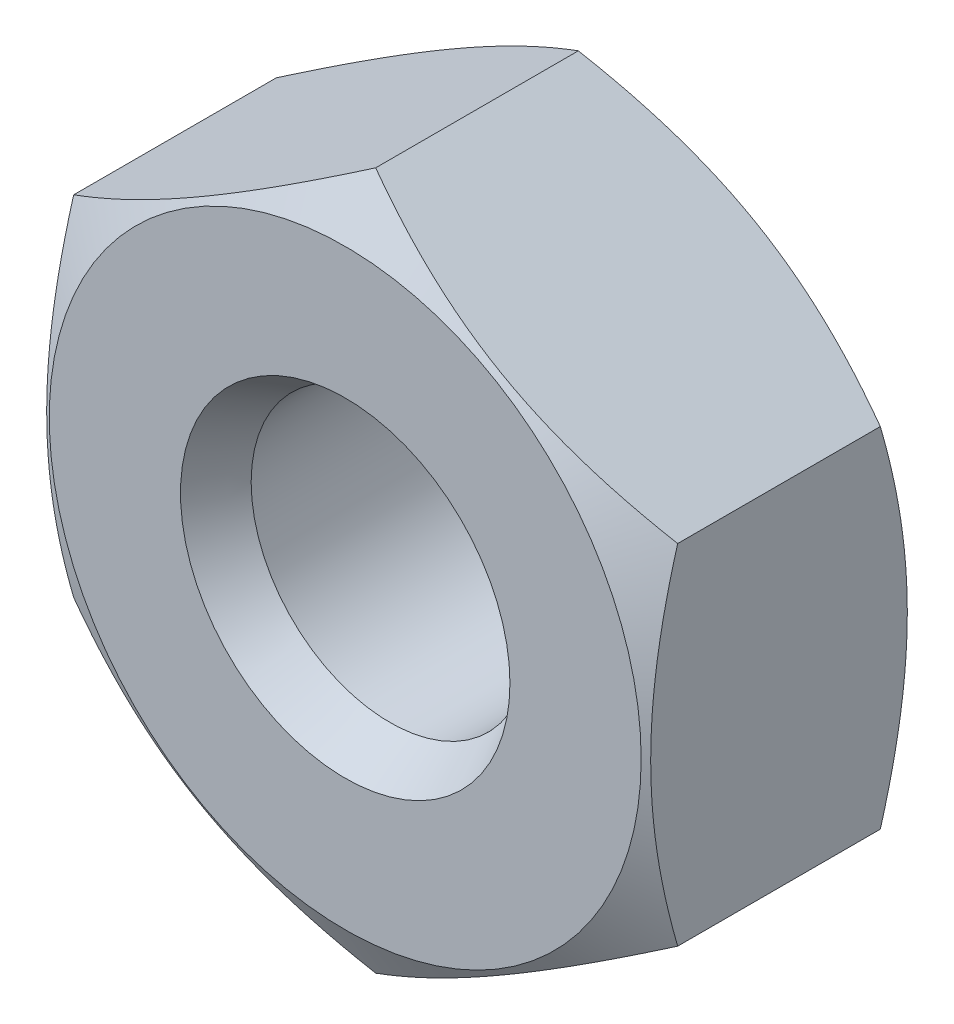
ISO-10303-21;
HEADER;
FILE_DESCRIPTION(('STEP AP214'),'2;1');
FILE_NAME('part.step','',(''),(''),'','','');
FILE_SCHEMA(('AUTOMOTIVE_DESIGN { 1 0 10303 214 1 1 1 1 }'));
ENDSEC;
DATA;
#1=APPLICATION_CONTEXT('core data for automotive mechanical design processes');
#2=APPLICATION_PROTOCOL_DEFINITION('international standard','automotive_design',2000,#1);
#3=PRODUCT_CONTEXT('',#1,'mechanical');
#4=PRODUCT('Part','Part','',(#3));
#5=PRODUCT_RELATED_PRODUCT_CATEGORY('part','',(#4));
#6=PRODUCT_DEFINITION_FORMATION('','',#4);
#7=PRODUCT_DEFINITION_CONTEXT('part definition',#1,'design');
#8=PRODUCT_DEFINITION('design','',#6,#7);
#9=PRODUCT_DEFINITION_SHAPE('','',#8);
#10=(LENGTH_UNIT() NAMED_UNIT(*) SI_UNIT(.MILLI.,.METRE.));
#11=(NAMED_UNIT(*) PLANE_ANGLE_UNIT() SI_UNIT($,.RADIAN.));
#12=(NAMED_UNIT(*) SI_UNIT($,.STERADIAN.) SOLID_ANGLE_UNIT());
#13=UNCERTAINTY_MEASURE_WITH_UNIT(LENGTH_MEASURE(1.E-05),#10,'distance_accuracy_value','');
#14=(GEOMETRIC_REPRESENTATION_CONTEXT(3) GLOBAL_UNCERTAINTY_ASSIGNED_CONTEXT((#13)) GLOBAL_UNIT_ASSIGNED_CONTEXT((#10,
#11,#12)) REPRESENTATION_CONTEXT('',''));
#15=CARTESIAN_POINT('',(0.,0.,0.));
#16=DIRECTION('',(0.,0.,1.));
#17=DIRECTION('',(1.,0.,0.));
#18=AXIS2_PLACEMENT_3D('',#15,#16,#17);
#19=CARTESIAN_POINT('',(0.,0.,1.2));
#20=DIRECTION('',(0.,0.,-1.));
#21=DIRECTION('',(-1.,0.,0.));
#22=AXIS2_PLACEMENT_3D('',#19,#20,#21);
#23=CYLINDRICAL_SURFACE('',#22,1.2645);
#24=CARTESIAN_POINT('',(0.,0.,0.407897965182469));
#25=DIRECTION('',(0.,0.,-1.));
#26=DIRECTION('',(-1.,0.,0.));
#27=AXIS2_PLACEMENT_3D('',#24,#25,#26);
#28=CIRCLE('',#27,1.2645);
#29=CARTESIAN_POINT('',(1.2645,0.,0.407897965182469));
#30=VERTEX_POINT('',#29);
#31=EDGE_CURVE('E290',#30,#30,#28,.T.);
#32=ORIENTED_EDGE('',*,*,#31,.T.);
#33=DIRECTION('',(0.,0.,1.));
#34=VECTOR('',#33,1.);
#35=CARTESIAN_POINT('',(1.2645,0.,1.2));
#36=LINE('',#35,#34);
#37=CARTESIAN_POINT('',(1.2645,0.,1.99210203481753));
#38=VERTEX_POINT('',#37);
#39=EDGE_CURVE('E11',#30,#38,#36,.T.);
#40=ORIENTED_EDGE('',*,*,#39,.T.);
#41=CARTESIAN_POINT('',(0.,0.,1.99210203481753));
#42=DIRECTION('',(0.,0.,1.));
#43=DIRECTION('',(-1.,0.,0.));
#44=AXIS2_PLACEMENT_3D('',#41,#42,#43);
#45=CIRCLE('',#44,1.2645);
#46=EDGE_CURVE('E259',#38,#38,#45,.T.);
#47=ORIENTED_EDGE('',*,*,#46,.T.);
#48=ORIENTED_EDGE('',*,*,#39,.F.);
#49=EDGE_LOOP('',(#32,#40,#47,#48));
#50=FACE_BOUND('',#49,.T.);
#51=ADVANCED_FACE('F17',(#50),#23,.F.);
#52=CARTESIAN_POINT('',(-1.5,0.,0.));
#53=DIRECTION('',(0.,0.,-1.));
#54=DIRECTION('',(0.,-1.,0.));
#55=AXIS2_PLACEMENT_3D('',#52,#53,#54);
#56=PLANE('',#55);
#57=CARTESIAN_POINT('',(0.,0.,0.));
#58=DIRECTION('',(0.,0.,1.));
#59=DIRECTION('',(-1.,0.,0.));
#60=AXIS2_PLACEMENT_3D('',#57,#58,#59);
#61=CIRCLE('',#60,1.5);
#62=CARTESIAN_POINT('',(1.5,0.,0.));
#63=VERTEX_POINT('',#62);
#64=EDGE_CURVE('E278',#63,#63,#61,.T.);
#65=ORIENTED_EDGE('',*,*,#64,.T.);
#66=EDGE_LOOP('',(#65));
#67=FACE_BOUND('',#66,.T.);
#68=CARTESIAN_POINT('',(0.,0.,0.));
#69=DIRECTION('',(0.,0.,-1.));
#70=DIRECTION('',(1.,0.,0.));
#71=AXIS2_PLACEMENT_3D('',#68,#69,#70);
#72=CIRCLE('',#71,2.695);
#73=CARTESIAN_POINT('',(2.695,0.,0.));
#74=VERTEX_POINT('',#73);
#75=EDGE_CURVE('E203',#74,#74,#72,.T.);
#76=ORIENTED_EDGE('',*,*,#75,.T.);
#77=EDGE_LOOP('',(#76));
#78=FACE_BOUND('',#77,.T.);
#79=ADVANCED_FACE('F411',(#67,#78),#56,.T.);
#80=CARTESIAN_POINT('',(0.,0.,2.26107509147625));
#81=DIRECTION('',(0.,0.,-1.));
#82=DIRECTION('',(-1.,0.,0.));
#83=AXIS2_PLACEMENT_3D('',#80,#81,#82);
#84=CONICAL_SURFACE('',#83,2.935625,1.0471975511966);
#85=CARTESIAN_POINT('',(0.,3.17542648054294,2.12262564213271));
#86=CARTESIAN_POINT('',(-1.375,2.38156986040721,2.58095897546604));
#87=CARTESIAN_POINT('',(-2.75,1.58771324027148,2.12262564213271));
#88=(BOUNDED_CURVE() B_SPLINE_CURVE(2,(#85,#86,#87),.UNSPECIFIED.,.F.,
.F.) B_SPLINE_CURVE_WITH_KNOTS((3,3),(0.00014427274622326,0.321515614919824),
.UNSPECIFIED.) CURVE() GEOMETRIC_REPRESENTATION_ITEM() RATIONAL_B_SPLINE_CURVE((1.00013898062186,
1.15486101937814,1.00013898062186)) REPRESENTATION_ITEM(''));
#89=CARTESIAN_POINT('',(0.,3.17542648054294,2.12262564213271));
#90=VERTEX_POINT('',#89);
#91=CARTESIAN_POINT('',(-2.75,1.58771324027148,2.12262564213271));
#92=VERTEX_POINT('',#91);
#93=EDGE_CURVE('E231',#90,#92,#88,.T.);
#94=ORIENTED_EDGE('',*,*,#93,.T.);
#95=CARTESIAN_POINT('',(-2.75,1.58771324027148,2.12262564213271));
#96=CARTESIAN_POINT('',(-2.75,0.,2.58095897546604));
#97=CARTESIAN_POINT('',(-2.75,-1.58771324027147,2.12262564213271));
#98=(BOUNDED_CURVE() B_SPLINE_CURVE(2,(#95,#96,#97),.UNSPECIFIED.,.F.,
.F.) B_SPLINE_CURVE_WITH_KNOTS((3,3),(0.000144272746223098,0.321515614919824),
.UNSPECIFIED.) CURVE() GEOMETRIC_REPRESENTATION_ITEM() RATIONAL_B_SPLINE_CURVE((1.00013898062186,
1.15486101937814,1.00013898062186)) REPRESENTATION_ITEM(''));
#99=CARTESIAN_POINT('',(-2.75,-1.58771324027147,2.12262564213271));
#100=VERTEX_POINT('',#99);
#101=EDGE_CURVE('E210',#92,#100,#98,.T.);
#102=ORIENTED_EDGE('',*,*,#101,.T.);
#103=CARTESIAN_POINT('',(-2.75,-1.58771324027147,2.12262564213271));
#104=CARTESIAN_POINT('',(-1.375,-2.3815698604072,2.58095897546604));
#105=CARTESIAN_POINT('',(0.,-3.17542648054294,2.12262564213271));
#106=(BOUNDED_CURVE() B_SPLINE_CURVE(2,(#103,#104,#105),.UNSPECIFIED.,.F.,
.F.) B_SPLINE_CURVE_WITH_KNOTS((3,3),(0.000144272746223187,0.321515614919824),
.UNSPECIFIED.) CURVE() GEOMETRIC_REPRESENTATION_ITEM() RATIONAL_B_SPLINE_CURVE((1.00013898062186,
1.15486101937814,1.00013898062186)) REPRESENTATION_ITEM(''));
#107=CARTESIAN_POINT('',(0.,-3.17542648054294,2.12262564213271));
#108=VERTEX_POINT('',#107);
#109=EDGE_CURVE('E47',#100,#108,#106,.T.);
#110=ORIENTED_EDGE('',*,*,#109,.T.);
#111=CARTESIAN_POINT('',(0.,-3.17542648054294,2.12262564213271));
#112=CARTESIAN_POINT('',(1.375,-2.38156986040721,2.58095897546604));
#113=CARTESIAN_POINT('',(2.75,-1.58771324027147,2.12262564213271));
#114=(BOUNDED_CURVE() B_SPLINE_CURVE(2,(#111,#112,#113),.UNSPECIFIED.,.F.,
.F.) B_SPLINE_CURVE_WITH_KNOTS((3,3),(0.000144272746223095,0.321515614919824),
.UNSPECIFIED.) CURVE() GEOMETRIC_REPRESENTATION_ITEM() RATIONAL_B_SPLINE_CURVE((1.00013898062186,
1.15486101937814,1.00013898062186)) REPRESENTATION_ITEM(''));
#115=CARTESIAN_POINT('',(2.75,-1.58771324027147,2.12262564213271));
#116=VERTEX_POINT('',#115);
#117=EDGE_CURVE('E86',#108,#116,#114,.T.);
#118=ORIENTED_EDGE('',*,*,#117,.T.);
#119=CARTESIAN_POINT('',(2.75,-1.58771324027147,2.12262564213271));
#120=CARTESIAN_POINT('',(2.75,-0.736860279185588,2.36824573519457));
#121=CARTESIAN_POINT('',(2.75,0.,2.36824573519457));
#122=(BOUNDED_CURVE() B_SPLINE_CURVE(2,(#119,#120,#121),.UNSPECIFIED.,.F.,
.F.) B_SPLINE_CURVE_WITH_KNOTS((3,3),(0.000144272746223094,0.160829943833024),
.UNSPECIFIED.) CURVE() GEOMETRIC_REPRESENTATION_ITEM() RATIONAL_B_SPLINE_CURVE((1.00013898062186,
1.0775,1.0775)) REPRESENTATION_ITEM(''));
#123=CARTESIAN_POINT('',(2.75,0.,2.36824573519457));
#124=VERTEX_POINT('',#123);
#125=EDGE_CURVE('E84',#116,#124,#122,.T.);
#126=ORIENTED_EDGE('',*,*,#125,.T.);
#127=DIRECTION('',(-0.866025403784438,0.,0.5));
#128=VECTOR('',#127,1.);
#129=CARTESIAN_POINT('',(2.935625,0.,2.26107509147625));
#130=LINE('',#129,#128);
#131=CARTESIAN_POINT('',(2.695,0.,2.4));
#132=VERTEX_POINT('',#131);
#133=EDGE_CURVE('E25',#124,#132,#130,.T.);
#134=ORIENTED_EDGE('',*,*,#133,.T.);
#135=CARTESIAN_POINT('',(0.,0.,2.4));
#136=DIRECTION('',(0.,0.,-1.));
#137=DIRECTION('',(1.,0.,0.));
#138=AXIS2_PLACEMENT_3D('',#135,#136,#137);
#139=CIRCLE('',#138,2.695);
#140=EDGE_CURVE('E81',#132,#132,#139,.T.);
#141=ORIENTED_EDGE('',*,*,#140,.T.);
#142=ORIENTED_EDGE('',*,*,#133,.F.);
#143=CARTESIAN_POINT('',(2.75,0.,2.36824573519457));
#144=CARTESIAN_POINT('',(2.75,0.736860279185584,2.36824573519457));
#145=CARTESIAN_POINT('',(2.75,1.58771324027147,2.12262564213271));
#146=(BOUNDED_CURVE() B_SPLINE_CURVE(2,(#143,#144,#145),.UNSPECIFIED.,.F.,
.F.) B_SPLINE_CURVE_WITH_KNOTS((3,3),(0.160829943833024,0.321515614919824),
.UNSPECIFIED.) CURVE() GEOMETRIC_REPRESENTATION_ITEM() RATIONAL_B_SPLINE_CURVE((1.0775,1.0775,1.00013898062186)) REPRESENTATION_ITEM(''));
#147=CARTESIAN_POINT('',(2.75,1.58771324027146,2.12262564213271));
#148=VERTEX_POINT('',#147);
#149=EDGE_CURVE('E78',#124,#148,#146,.T.);
#150=ORIENTED_EDGE('',*,*,#149,.T.);
#151=CARTESIAN_POINT('',(2.75,1.58771324027146,2.12262564213271));
#152=CARTESIAN_POINT('',(1.375,2.3815698604072,2.58095897546604));
#153=CARTESIAN_POINT('',(0.,3.17542648054294,2.12262564213271));
#154=(BOUNDED_CURVE() B_SPLINE_CURVE(2,(#151,#152,#153),.UNSPECIFIED.,.F.,
.F.) B_SPLINE_CURVE_WITH_KNOTS((3,3),(0.000144272746223033,0.321515614919824),
.UNSPECIFIED.) CURVE() GEOMETRIC_REPRESENTATION_ITEM() RATIONAL_B_SPLINE_CURVE((1.00013898062186,
1.15486101937814,1.00013898062186)) REPRESENTATION_ITEM(''));
#155=EDGE_CURVE('E104',#148,#90,#154,.T.);
#156=ORIENTED_EDGE('',*,*,#155,.T.);
#157=EDGE_LOOP('',(#94,#102,#110,#118,#126,#134,#141,#142,#150,#156));
#158=FACE_BOUND('',#157,.T.);
#159=ADVANCED_FACE('F75',(#158),#84,.T.);
#160=CARTESIAN_POINT('',(-2.695,0.,2.4));
#161=DIRECTION('',(0.,0.,1.));
#162=DIRECTION('',(1.,0.,0.));
#163=AXIS2_PLACEMENT_3D('',#160,#161,#162);
#164=PLANE('',#163);
#165=CARTESIAN_POINT('',(0.,0.,2.4));
#166=DIRECTION('',(0.,0.,-1.));
#167=DIRECTION('',(-1.,0.,0.));
#168=AXIS2_PLACEMENT_3D('',#165,#166,#167);
#169=CIRCLE('',#168,1.5);
#170=CARTESIAN_POINT('',(1.5,0.,2.4));
#171=VERTEX_POINT('',#170);
#172=EDGE_CURVE('E272',#171,#171,#169,.T.);
#173=ORIENTED_EDGE('',*,*,#172,.T.);
#174=EDGE_LOOP('',(#173));
#175=FACE_BOUND('',#174,.T.);
#176=ORIENTED_EDGE('',*,*,#140,.F.);
#177=EDGE_LOOP('',(#176));
#178=FACE_BOUND('',#177,.T.);
#179=ADVANCED_FACE('F454',(#175,#178),#164,.T.);
#180=CARTESIAN_POINT('',(-2.75142582323749,-1.58689004084148,2.4));
#181=DIRECTION('',(0.5,0.866025403784438,0.));
#182=DIRECTION('',(0.,0.,-1.));
#183=AXIS2_PLACEMENT_3D('',#180,#181,#182);
#184=PLANE('',#183);
#185=DIRECTION('',(0.,0.,1.));
#186=VECTOR('',#185,1.);
#187=CARTESIAN_POINT('',(0.,-3.17542648054294,2.4));
#188=LINE('',#187,#186);
#189=CARTESIAN_POINT('',(0.,-3.17542648054294,0.277374357867291));
#190=VERTEX_POINT('',#189);
#191=EDGE_CURVE('E124',#190,#108,#188,.T.);
#192=ORIENTED_EDGE('',*,*,#191,.T.);
#193=ORIENTED_EDGE('',*,*,#109,.F.);
#194=DIRECTION('',(0.,0.,1.));
#195=VECTOR('',#194,1.);
#196=CARTESIAN_POINT('',(-2.75,-1.58771324027147,2.4));
#197=LINE('',#196,#195);
#198=CARTESIAN_POINT('',(-2.75,-1.58771324027147,0.277374357867291));
#199=VERTEX_POINT('',#198);
#200=EDGE_CURVE('E216',#199,#100,#197,.T.);
#201=ORIENTED_EDGE('',*,*,#200,.F.);
#202=CARTESIAN_POINT('',(0.,-3.17542648054294,0.277374357867291));
#203=CARTESIAN_POINT('',(-1.375,-2.3815698604072,-0.180958975466043));
#204=CARTESIAN_POINT('',(-2.75,-1.58771324027147,0.277374357867291));
#205=(BOUNDED_CURVE() B_SPLINE_CURVE(2,(#202,#203,#204),.UNSPECIFIED.,.F.,
.F.) B_SPLINE_CURVE_WITH_KNOTS((3,3),(0.000144272746223221,0.321515614919824),
.UNSPECIFIED.) CURVE() GEOMETRIC_REPRESENTATION_ITEM() RATIONAL_B_SPLINE_CURVE((1.00013898062186,
1.15486101937814,1.00013898062186)) REPRESENTATION_ITEM(''));
#206=EDGE_CURVE('E175',#190,#199,#205,.T.);
#207=ORIENTED_EDGE('',*,*,#206,.F.);
#208=EDGE_LOOP('',(#192,#193,#201,#207));
#209=FACE_BOUND('',#208,.T.);
#210=ADVANCED_FACE('F422',(#209),#184,.F.);
#211=CARTESIAN_POINT('',(-0.00142582323749557,-3.17624967997292,2.4));
#212=DIRECTION('',(-0.5,0.866025403784439,0.));
#213=DIRECTION('',(0.,0.,1.));
#214=AXIS2_PLACEMENT_3D('',#211,#212,#213);
#215=PLANE('',#214);
#216=DIRECTION('',(0.,0.,1.));
#217=VECTOR('',#216,1.);
#218=CARTESIAN_POINT('',(2.75,-1.58771324027147,2.4));
#219=LINE('',#218,#217);
#220=CARTESIAN_POINT('',(2.75,-1.58771324027147,0.277374357867291));
#221=VERTEX_POINT('',#220);
#222=EDGE_CURVE('E91',#221,#116,#219,.T.);
#223=ORIENTED_EDGE('',*,*,#222,.T.);
#224=ORIENTED_EDGE('',*,*,#117,.F.);
#225=ORIENTED_EDGE('',*,*,#191,.F.);
#226=CARTESIAN_POINT('',(2.75,-1.58771324027147,0.277374357867291));
#227=CARTESIAN_POINT('',(1.375,-2.38156986040721,-0.180958975466044));
#228=CARTESIAN_POINT('',(0.,-3.17542648054294,0.277374357867291));
#229=(BOUNDED_CURVE() B_SPLINE_CURVE(2,(#226,#227,#228),.UNSPECIFIED.,.F.,
.F.) B_SPLINE_CURVE_WITH_KNOTS((3,3),(0.000144272746223154,0.321515614919824),
.UNSPECIFIED.) CURVE() GEOMETRIC_REPRESENTATION_ITEM() RATIONAL_B_SPLINE_CURVE((1.00013898062186,
1.15486101937814,1.00013898062186)) REPRESENTATION_ITEM(''));
#230=EDGE_CURVE('E181',#221,#190,#229,.T.);
#231=ORIENTED_EDGE('',*,*,#230,.F.);
#232=EDGE_LOOP('',(#223,#224,#225,#231));
#233=FACE_BOUND('',#232,.T.);
#234=ADVANCED_FACE('F420',(#233),#215,.F.);
#235=CARTESIAN_POINT('',(2.75,-1.58935963913144,2.4));
#236=DIRECTION('',(-1.,0.,0.));
#237=DIRECTION('',(0.,0.,1.));
#238=AXIS2_PLACEMENT_3D('',#235,#236,#237);
#239=PLANE('',#238);
#240=DIRECTION('',(0.,0.,1.));
#241=VECTOR('',#240,1.);
#242=CARTESIAN_POINT('',(2.75,1.58771324027147,2.4));
#243=LINE('',#242,#241);
#244=CARTESIAN_POINT('',(2.75,1.58771324027147,0.277374357867291));
#245=VERTEX_POINT('',#244);
#246=EDGE_CURVE('E96',#245,#148,#243,.T.);
#247=ORIENTED_EDGE('',*,*,#246,.T.);
#248=ORIENTED_EDGE('',*,*,#149,.F.);
#249=ORIENTED_EDGE('',*,*,#125,.F.);
#250=ORIENTED_EDGE('',*,*,#222,.F.);
#251=CARTESIAN_POINT('',(2.75,0.,0.0317542648054287));
#252=CARTESIAN_POINT('',(2.75,-0.736860279185588,0.0317542648054282));
#253=CARTESIAN_POINT('',(2.75,-1.58771324027147,0.277374357867291));
#254=(BOUNDED_CURVE() B_SPLINE_CURVE(2,(#251,#252,#253),.UNSPECIFIED.,.F.,
.F.) B_SPLINE_CURVE_WITH_KNOTS((3,3),(0.160829943833023,0.321515614919824),
.UNSPECIFIED.) CURVE() GEOMETRIC_REPRESENTATION_ITEM() RATIONAL_B_SPLINE_CURVE((1.0775,1.0775,1.00013898062186)) REPRESENTATION_ITEM(''));
#255=CARTESIAN_POINT('',(2.75,0.,0.0317542648054287));
#256=VERTEX_POINT('',#255);
#257=EDGE_CURVE('E188',#256,#221,#254,.T.);
#258=ORIENTED_EDGE('',*,*,#257,.F.);
#259=CARTESIAN_POINT('',(2.75,1.58771324027147,0.277374357867291));
#260=CARTESIAN_POINT('',(2.75,0.736860279185584,0.0317542648054293));
#261=CARTESIAN_POINT('',(2.75,0.,0.0317542648054287));
#262=(BOUNDED_CURVE() B_SPLINE_CURVE(2,(#259,#260,#261),.UNSPECIFIED.,.F.,
.F.) B_SPLINE_CURVE_WITH_KNOTS((3,3),(0.000144272746223245,0.160829943833023),
.UNSPECIFIED.) CURVE() GEOMETRIC_REPRESENTATION_ITEM() RATIONAL_B_SPLINE_CURVE((1.00013898062186,
1.0775,1.0775)) REPRESENTATION_ITEM(''));
#263=EDGE_CURVE('E166',#245,#256,#262,.T.);
#264=ORIENTED_EDGE('',*,*,#263,.F.);
#265=EDGE_LOOP('',(#247,#248,#249,#250,#258,#264));
#266=FACE_BOUND('',#265,.T.);
#267=ADVANCED_FACE('F93',(#266),#239,.F.);
#268=CARTESIAN_POINT('',(2.75142582323749,1.58689004084148,2.4));
#269=DIRECTION('',(-0.5,-0.866025403784438,0.));
#270=DIRECTION('',(-0.866025403784438,0.5,0.));
#271=AXIS2_PLACEMENT_3D('',#268,#269,#270);
#272=PLANE('',#271);
#273=DIRECTION('',(0.,0.,1.));
#274=VECTOR('',#273,1.);
#275=CARTESIAN_POINT('',(0.,3.17542648054294,2.4));
#276=LINE('',#275,#274);
#277=CARTESIAN_POINT('',(0.,3.17542648054294,0.277374357867291));
#278=VERTEX_POINT('',#277);
#279=EDGE_CURVE('E253',#278,#90,#276,.T.);
#280=ORIENTED_EDGE('',*,*,#279,.T.);
#281=ORIENTED_EDGE('',*,*,#155,.F.);
#282=ORIENTED_EDGE('',*,*,#246,.F.);
#283=CARTESIAN_POINT('',(0.,3.17542648054294,0.277374357867291));
#284=CARTESIAN_POINT('',(1.375,2.3815698604072,-0.180958975466042));
#285=CARTESIAN_POINT('',(2.75,1.58771324027147,0.277374357867291));
#286=(BOUNDED_CURVE() B_SPLINE_CURVE(2,(#283,#284,#285),.UNSPECIFIED.,.F.,
.F.) B_SPLINE_CURVE_WITH_KNOTS((3,3),(0.000144272746223258,0.321515614919824),
.UNSPECIFIED.) CURVE() GEOMETRIC_REPRESENTATION_ITEM() RATIONAL_B_SPLINE_CURVE((1.00013898062186,
1.15486101937814,1.00013898062186)) REPRESENTATION_ITEM(''));
#287=EDGE_CURVE('E170',#278,#245,#286,.T.);
#288=ORIENTED_EDGE('',*,*,#287,.F.);
#289=EDGE_LOOP('',(#280,#281,#282,#288));
#290=FACE_BOUND('',#289,.T.);
#291=ADVANCED_FACE('F373',(#290),#272,.F.);
#292=CARTESIAN_POINT('',(0.,0.,0.138924908523754));
#293=DIRECTION('',(0.,0.,1.));
#294=DIRECTION('',(-1.,0.,0.));
#295=AXIS2_PLACEMENT_3D('',#292,#293,#294);
#296=CONICAL_SURFACE('',#295,2.935625,1.0471975511966);
#297=ORIENTED_EDGE('',*,*,#75,.F.);
#298=DIRECTION('',(0.866025403784439,0.,0.5));
#299=VECTOR('',#298,1.);
#300=CARTESIAN_POINT('',(2.935625,0.,0.138924908523754));
#301=LINE('',#300,#299);
#302=EDGE_CURVE('E196',#74,#256,#301,.T.);
#303=ORIENTED_EDGE('',*,*,#302,.T.);
#304=ORIENTED_EDGE('',*,*,#257,.T.);
#305=ORIENTED_EDGE('',*,*,#230,.T.);
#306=ORIENTED_EDGE('',*,*,#206,.T.);
#307=CARTESIAN_POINT('',(-2.75,-1.58771324027147,0.277374357867291));
#308=CARTESIAN_POINT('',(-2.75,0.,-0.180958975466043));
#309=CARTESIAN_POINT('',(-2.75,1.58771324027148,0.277374357867292));
#310=(BOUNDED_CURVE() B_SPLINE_CURVE(2,(#307,#308,#309),.UNSPECIFIED.,.F.,
.F.) B_SPLINE_CURVE_WITH_KNOTS((3,3),(0.000144272746223075,0.321515614919824),
.UNSPECIFIED.) CURVE() GEOMETRIC_REPRESENTATION_ITEM() RATIONAL_B_SPLINE_CURVE((1.00013898062186,
1.15486101937814,1.00013898062186)) REPRESENTATION_ITEM(''));
#311=CARTESIAN_POINT('',(-2.75,1.58771324027148,0.277374357867292));
#312=VERTEX_POINT('',#311);
#313=EDGE_CURVE('E223',#199,#312,#310,.T.);
#314=ORIENTED_EDGE('',*,*,#313,.T.);
#315=CARTESIAN_POINT('',(-2.75,1.58771324027148,0.277374357867292));
#316=CARTESIAN_POINT('',(-1.37499999999999,2.38156986040721,-0.180958975466043));
#317=CARTESIAN_POINT('',(0.,3.17542648054294,0.277374357867291));
#318=(BOUNDED_CURVE() B_SPLINE_CURVE(2,(#315,#316,#317),.UNSPECIFIED.,.F.,
.F.) B_SPLINE_CURVE_WITH_KNOTS((3,3),(0.000144272746223111,0.321515614919824),
.UNSPECIFIED.) CURVE() GEOMETRIC_REPRESENTATION_ITEM() RATIONAL_B_SPLINE_CURVE((1.00013898062186,
1.15486101937814,1.00013898062186)) REPRESENTATION_ITEM(''));
#319=EDGE_CURVE('E245',#312,#278,#318,.T.);
#320=ORIENTED_EDGE('',*,*,#319,.T.);
#321=ORIENTED_EDGE('',*,*,#287,.T.);
#322=ORIENTED_EDGE('',*,*,#263,.T.);
#323=ORIENTED_EDGE('',*,*,#302,.F.);
#324=EDGE_LOOP('',(#297,#303,#304,#305,#306,#314,#320,#321,#322,#323));
#325=FACE_BOUND('',#324,.T.);
#326=ADVANCED_FACE('F379',(#325),#296,.T.);
#327=CARTESIAN_POINT('',(-2.75,1.58935963913144,2.4));
#328=DIRECTION('',(1.,0.,0.));
#329=DIRECTION('',(0.,-1.,0.));
#330=AXIS2_PLACEMENT_3D('',#327,#328,#329);
#331=PLANE('',#330);
#332=DIRECTION('',(0.,0.,-1.));
#333=VECTOR('',#332,1.);
#334=CARTESIAN_POINT('',(-2.75,1.58771324027148,2.4));
#335=LINE('',#334,#333);
#336=EDGE_CURVE('E237',#92,#312,#335,.T.);
#337=ORIENTED_EDGE('',*,*,#336,.T.);
#338=ORIENTED_EDGE('',*,*,#313,.F.);
#339=ORIENTED_EDGE('',*,*,#200,.T.);
#340=ORIENTED_EDGE('',*,*,#101,.F.);
#341=EDGE_LOOP('',(#337,#338,#339,#340));
#342=FACE_BOUND('',#341,.T.);
#343=ADVANCED_FACE('F424',(#342),#331,.F.);
#344=CARTESIAN_POINT('',(0.00142582323749751,3.17624967997292,2.4));
#345=DIRECTION('',(0.5,-0.86602540378444,0.));
#346=DIRECTION('',(0.,0.,-1.));
#347=AXIS2_PLACEMENT_3D('',#344,#345,#346);
#348=PLANE('',#347);
#349=ORIENTED_EDGE('',*,*,#279,.F.);
#350=ORIENTED_EDGE('',*,*,#319,.F.);
#351=ORIENTED_EDGE('',*,*,#336,.F.);
#352=ORIENTED_EDGE('',*,*,#93,.F.);
#353=EDGE_LOOP('',(#349,#350,#351,#352));
#354=FACE_BOUND('',#353,.T.);
#355=ADVANCED_FACE('F370',(#354),#348,.F.);
#356=CARTESIAN_POINT('',(0.,0.,1.8));
#357=DIRECTION('',(0.,0.,1.));
#358=DIRECTION('',(-1.,0.,0.));
#359=AXIS2_PLACEMENT_3D('',#356,#357,#358);
#360=CONICAL_SURFACE('',#359,1.15358983848622,0.523598775598299);
#361=ORIENTED_EDGE('',*,*,#172,.F.);
#362=DIRECTION('',(-0.5,0.,-0.866025403784438));
#363=VECTOR('',#362,1.);
#364=CARTESIAN_POINT('',(1.15358983848622,0.,1.8));
#365=LINE('',#364,#363);
#366=EDGE_CURVE('E265',#171,#38,#365,.T.);
#367=ORIENTED_EDGE('',*,*,#366,.T.);
#368=ORIENTED_EDGE('',*,*,#46,.F.);
#369=ORIENTED_EDGE('',*,*,#366,.F.);
#370=EDGE_LOOP('',(#361,#367,#368,#369));
#371=FACE_BOUND('',#370,.T.);
#372=ADVANCED_FACE('F432',(#371),#360,.F.);
#373=CARTESIAN_POINT('',(0.,0.,0.6));
#374=DIRECTION('',(0.,0.,-1.));
#375=DIRECTION('',(-1.,0.,0.));
#376=AXIS2_PLACEMENT_3D('',#373,#374,#375);
#377=CONICAL_SURFACE('',#376,1.15358983848622,0.523598775598299);
#378=ORIENTED_EDGE('',*,*,#31,.F.);
#379=DIRECTION('',(0.5,0.,-0.866025403784438));
#380=VECTOR('',#379,1.);
#381=CARTESIAN_POINT('',(1.15358983848622,0.,0.6));
#382=LINE('',#381,#380);
#383=EDGE_CURVE('E284',#30,#63,#382,.T.);
#384=ORIENTED_EDGE('',*,*,#383,.T.);
#385=ORIENTED_EDGE('',*,*,#64,.F.);
#386=ORIENTED_EDGE('',*,*,#383,.F.);
#387=EDGE_LOOP('',(#378,#384,#385,#386));
#388=FACE_BOUND('',#387,.T.);
#389=ADVANCED_FACE('F409',(#388),#377,.F.);
#390=CLOSED_SHELL('',(#51,#79,#159,#179,#210,#234,#267,#291,#326,#343,#355,#372,#389));
#391=MANIFOLD_SOLID_BREP('B1',#390);
#392=ADVANCED_BREP_SHAPE_REPRESENTATION('',(#18,#391),#14);
#393=SHAPE_DEFINITION_REPRESENTATION(#9,#392);
ENDSEC;
END-ISO-10303-21;
